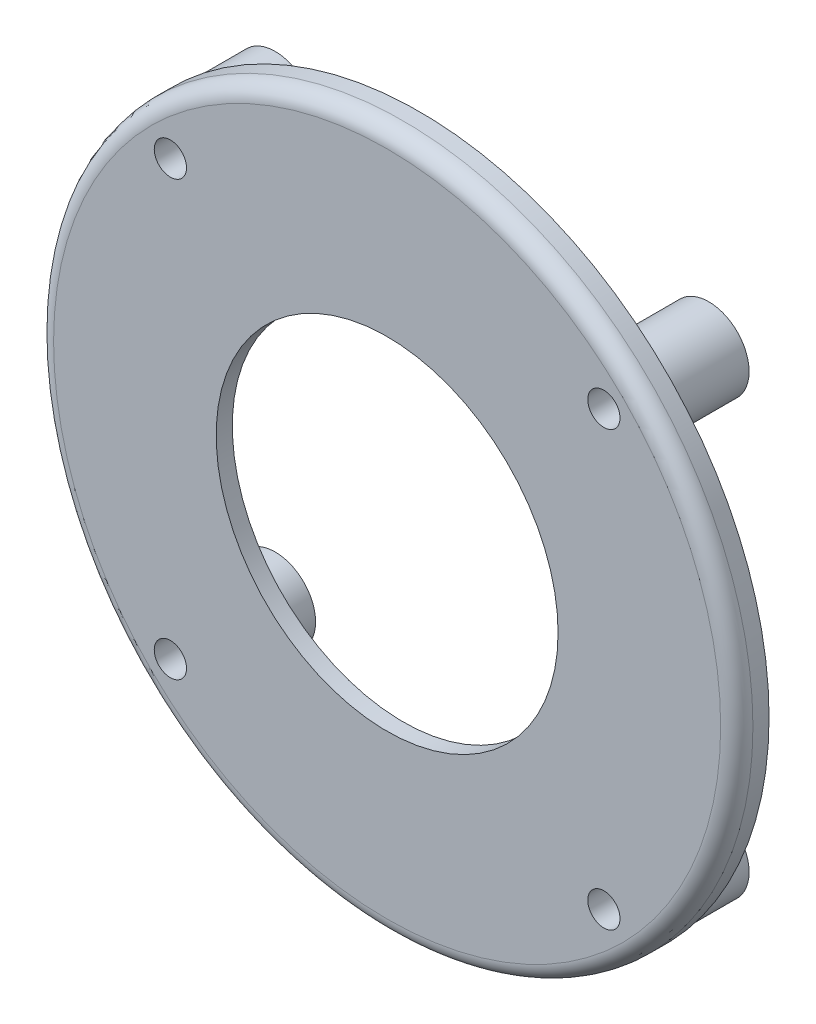
ISO-10303-21;
HEADER;
FILE_DESCRIPTION(('STEP AP214'),'2;1');
FILE_NAME('part.step','',(''),(''),'','','');
FILE_SCHEMA(('AUTOMOTIVE_DESIGN { 1 0 10303 214 1 1 1 1 }'));
ENDSEC;
DATA;
#1=APPLICATION_CONTEXT('core data for automotive mechanical design processes');
#2=APPLICATION_PROTOCOL_DEFINITION('international standard','automotive_design',2000,#1);
#3=PRODUCT_CONTEXT('',#1,'mechanical');
#4=PRODUCT('Part','Part','',(#3));
#5=PRODUCT_RELATED_PRODUCT_CATEGORY('part','',(#4));
#6=PRODUCT_DEFINITION_FORMATION('','',#4);
#7=PRODUCT_DEFINITION_CONTEXT('part definition',#1,'design');
#8=PRODUCT_DEFINITION('design','',#6,#7);
#9=PRODUCT_DEFINITION_SHAPE('','',#8);
#10=(LENGTH_UNIT() NAMED_UNIT(*) SI_UNIT(.MILLI.,.METRE.));
#11=(NAMED_UNIT(*) PLANE_ANGLE_UNIT() SI_UNIT($,.RADIAN.));
#12=(NAMED_UNIT(*) SI_UNIT($,.STERADIAN.) SOLID_ANGLE_UNIT());
#13=UNCERTAINTY_MEASURE_WITH_UNIT(LENGTH_MEASURE(1.E-05),#10,'distance_accuracy_value','');
#14=(GEOMETRIC_REPRESENTATION_CONTEXT(3) GLOBAL_UNCERTAINTY_ASSIGNED_CONTEXT((#13)) GLOBAL_UNIT_ASSIGNED_CONTEXT((#10,
#11,#12)) REPRESENTATION_CONTEXT('',''));
#15=CARTESIAN_POINT('',(0.,0.,0.));
#16=DIRECTION('',(0.,0.,1.));
#17=DIRECTION('',(1.,0.,0.));
#18=AXIS2_PLACEMENT_3D('',#15,#16,#17);
#19=CARTESIAN_POINT('',(26.8844640576044,-24.9086338768124,-10.));
#20=DIRECTION('',(0.,0.,1.));
#21=DIRECTION('',(1.,0.,0.));
#22=AXIS2_PLACEMENT_3D('',#19,#20,#21);
#23=CYLINDRICAL_SURFACE('',#22,2.);
#24=CARTESIAN_POINT('',(26.8844640576046,-24.9086338768121,3.));
#25=DIRECTION('',(0.,0.,1.));
#26=DIRECTION('',(0.,-1.,0.));
#27=AXIS2_PLACEMENT_3D('',#24,#25,#26);
#28=CIRCLE('',#27,2.);
#29=CARTESIAN_POINT('',(26.8844640576047,-26.9086338768121,3.));
#30=VERTEX_POINT('',#29);
#31=EDGE_CURVE('E128',#30,#30,#28,.T.);
#32=ORIENTED_EDGE('',*,*,#31,.T.);
#33=EDGE_LOOP('',(#32));
#34=FACE_BOUND('',#33,.T.);
#35=CARTESIAN_POINT('',(26.8844640576044,-24.9086338768124,-6.));
#36=DIRECTION('',(0.,0.,-1.));
#37=DIRECTION('',(-1.,0.,0.));
#38=AXIS2_PLACEMENT_3D('',#35,#36,#37);
#39=CIRCLE('',#38,2.);
#40=CARTESIAN_POINT('',(24.8844640576044,-24.9086338768124,-6.));
#41=VERTEX_POINT('',#40);
#42=EDGE_CURVE('E10',#41,#41,#39,.F.);
#43=ORIENTED_EDGE('',*,*,#42,.F.);
#44=EDGE_LOOP('',(#43));
#45=FACE_BOUND('',#44,.T.);
#46=ADVANCED_FACE('F39',(#34,#45),#23,.F.);
#47=CARTESIAN_POINT('',(-26.8556513125733,-24.9086338768125,-10.));
#48=DIRECTION('',(0.,0.,1.));
#49=DIRECTION('',(1.,0.,0.));
#50=AXIS2_PLACEMENT_3D('',#47,#48,#49);
#51=CYLINDRICAL_SURFACE('',#50,2.);
#52=CARTESIAN_POINT('',(-26.8556513125732,-24.9086338768125,3.));
#53=DIRECTION('',(0.,0.,1.));
#54=DIRECTION('',(-1.,0.,0.));
#55=AXIS2_PLACEMENT_3D('',#52,#53,#54);
#56=CIRCLE('',#55,2.);
#57=CARTESIAN_POINT('',(-28.8556513125732,-24.9086338768125,3.));
#58=VERTEX_POINT('',#57);
#59=EDGE_CURVE('E132',#58,#58,#56,.T.);
#60=ORIENTED_EDGE('',*,*,#59,.T.);
#61=EDGE_LOOP('',(#60));
#62=FACE_BOUND('',#61,.T.);
#63=CARTESIAN_POINT('',(-26.8556513125733,-24.9086338768125,-6.));
#64=DIRECTION('',(0.,0.,-1.));
#65=DIRECTION('',(-1.,0.,0.));
#66=AXIS2_PLACEMENT_3D('',#63,#64,#65);
#67=CIRCLE('',#66,2.);
#68=CARTESIAN_POINT('',(-28.8556513125732,-24.9086338768125,-6.));
#69=VERTEX_POINT('',#68);
#70=EDGE_CURVE('E47',#69,#69,#67,.F.);
#71=ORIENTED_EDGE('',*,*,#70,.F.);
#72=EDGE_LOOP('',(#71));
#73=FACE_BOUND('',#72,.T.);
#74=ADVANCED_FACE('F201',(#62,#73),#51,.F.);
#75=CARTESIAN_POINT('',(-26.8556513125733,28.8314814933651,-10.));
#76=DIRECTION('',(0.,0.,1.));
#77=DIRECTION('',(1.,0.,0.));
#78=AXIS2_PLACEMENT_3D('',#75,#76,#77);
#79=CYLINDRICAL_SURFACE('',#78,2.);
#80=CARTESIAN_POINT('',(-26.8556513125734,28.831481493365,3.));
#81=DIRECTION('',(0.,0.,1.));
#82=DIRECTION('',(0.,1.,0.));
#83=AXIS2_PLACEMENT_3D('',#80,#81,#82);
#84=CIRCLE('',#83,2.);
#85=CARTESIAN_POINT('',(-26.8556513125734,30.831481493365,3.));
#86=VERTEX_POINT('',#85);
#87=EDGE_CURVE('E127',#86,#86,#84,.T.);
#88=ORIENTED_EDGE('',*,*,#87,.T.);
#89=EDGE_LOOP('',(#88));
#90=FACE_BOUND('',#89,.T.);
#91=CARTESIAN_POINT('',(-26.8556513125733,28.8314814933651,-6.));
#92=DIRECTION('',(0.,0.,-1.));
#93=DIRECTION('',(-1.,0.,0.));
#94=AXIS2_PLACEMENT_3D('',#91,#92,#93);
#95=CIRCLE('',#94,2.);
#96=CARTESIAN_POINT('',(-28.8556513125733,28.8314814933651,-6.));
#97=VERTEX_POINT('',#96);
#98=EDGE_CURVE('E52',#97,#97,#95,.F.);
#99=ORIENTED_EDGE('',*,*,#98,.F.);
#100=EDGE_LOOP('',(#99));
#101=FACE_BOUND('',#100,.T.);
#102=ADVANCED_FACE('F207',(#90,#101),#79,.F.);
#103=CARTESIAN_POINT('',(26.8844640576043,28.8314814933652,-10.));
#104=DIRECTION('',(0.,0.,1.));
#105=DIRECTION('',(1.,0.,0.));
#106=AXIS2_PLACEMENT_3D('',#103,#104,#105);
#107=CYLINDRICAL_SURFACE('',#106,2.);
#108=CARTESIAN_POINT('',(26.8844640576043,28.8314814933652,3.));
#109=DIRECTION('',(0.,0.,1.));
#110=DIRECTION('',(1.,0.,0.));
#111=AXIS2_PLACEMENT_3D('',#108,#109,#110);
#112=CIRCLE('',#111,2.);
#113=CARTESIAN_POINT('',(28.8844640576043,28.8314814933652,3.));
#114=VERTEX_POINT('',#113);
#115=EDGE_CURVE('E120',#114,#114,#112,.T.);
#116=ORIENTED_EDGE('',*,*,#115,.T.);
#117=EDGE_LOOP('',(#116));
#118=FACE_BOUND('',#117,.T.);
#119=CARTESIAN_POINT('',(26.8844640576043,28.8314814933652,-6.));
#120=DIRECTION('',(0.,0.,-1.));
#121=DIRECTION('',(-1.,0.,0.));
#122=AXIS2_PLACEMENT_3D('',#119,#120,#121);
#123=CIRCLE('',#122,2.);
#124=CARTESIAN_POINT('',(24.8844640576042,28.8314814933652,-6.));
#125=VERTEX_POINT('',#124);
#126=EDGE_CURVE('E57',#125,#125,#123,.F.);
#127=ORIENTED_EDGE('',*,*,#126,.F.);
#128=EDGE_LOOP('',(#127));
#129=FACE_BOUND('',#128,.T.);
#130=ADVANCED_FACE('F195',(#118,#129),#107,.F.);
#131=CARTESIAN_POINT('',(26.8844640576044,-24.9086338768124,-10.));
#132=DIRECTION('',(0.,0.,1.));
#133=DIRECTION('',(1.,0.,0.));
#134=AXIS2_PLACEMENT_3D('',#131,#132,#133);
#135=CYLINDRICAL_SURFACE('',#134,5.);
#136=CARTESIAN_POINT('',(26.8844640576044,-24.9086338768124,-10.));
#137=DIRECTION('',(0.,0.,1.));
#138=DIRECTION('',(1.,0.,0.));
#139=AXIS2_PLACEMENT_3D('',#136,#137,#138);
#140=CIRCLE('',#139,5.);
#141=CARTESIAN_POINT('',(31.8844640576044,-24.9086338768124,-10.));
#142=VERTEX_POINT('',#141);
#143=EDGE_CURVE('E75',#142,#142,#140,.T.);
#144=ORIENTED_EDGE('',*,*,#143,.T.);
#145=EDGE_LOOP('',(#144));
#146=FACE_BOUND('',#145,.T.);
#147=CARTESIAN_POINT('',(26.8844640576044,-24.9086338768124,-1.));
#148=DIRECTION('',(0.,0.,1.));
#149=DIRECTION('',(1.,0.,0.));
#150=AXIS2_PLACEMENT_3D('',#147,#148,#149);
#151=CIRCLE('',#150,5.);
#152=CARTESIAN_POINT('',(31.8844640576044,-24.9086338768124,-1.));
#153=VERTEX_POINT('',#152);
#154=EDGE_CURVE('E95',#153,#153,#151,.F.);
#155=ORIENTED_EDGE('',*,*,#154,.T.);
#156=EDGE_LOOP('',(#155));
#157=FACE_BOUND('',#156,.T.);
#158=ADVANCED_FACE('F183',(#146,#157),#135,.T.);
#159=CARTESIAN_POINT('',(26.8844640576044,-24.9086338768124,-10.));
#160=DIRECTION('',(0.,0.,1.));
#161=DIRECTION('',(1.,0.,0.));
#162=AXIS2_PLACEMENT_3D('',#159,#160,#161);
#163=PLANE('',#162);
#164=ORIENTED_EDGE('',*,*,#143,.F.);
#165=EDGE_LOOP('',(#164));
#166=FACE_BOUND('',#165,.T.);
#167=CARTESIAN_POINT('',(26.8844640576046,-24.9086338768121,-10.));
#168=DIRECTION('',(0.,0.,-1.));
#169=DIRECTION('',(0.,1.,0.));
#170=AXIS2_PLACEMENT_3D('',#167,#168,#169);
#171=CIRCLE('',#170,1.55);
#172=CARTESIAN_POINT('',(26.8844640576046,-23.3586338768121,-10.));
#173=VERTEX_POINT('',#172);
#174=EDGE_CURVE('E164',#173,#173,#171,.T.);
#175=ORIENTED_EDGE('',*,*,#174,.F.);
#176=EDGE_LOOP('',(#175));
#177=FACE_BOUND('',#176,.T.);
#178=ADVANCED_FACE('F180',(#166,#177),#163,.F.);
#179=CARTESIAN_POINT('',(0.014406372515511,1.96142380827636,-1.));
#180=DIRECTION('',(0.,0.,1.));
#181=DIRECTION('',(1.,0.,0.));
#182=AXIS2_PLACEMENT_3D('',#179,#180,#181);
#183=PLANE('',#182);
#184=CARTESIAN_POINT('',(26.8844640576043,28.8314814933652,-1.));
#185=DIRECTION('',(0.,0.,1.));
#186=DIRECTION('',(1.,0.,0.));
#187=AXIS2_PLACEMENT_3D('',#184,#185,#186);
#188=CIRCLE('',#187,5.);
#189=CARTESIAN_POINT('',(31.8844640576042,28.8314814933652,-1.));
#190=VERTEX_POINT('',#189);
#191=EDGE_CURVE('E76',#190,#190,#188,.T.);
#192=ORIENTED_EDGE('',*,*,#191,.T.);
#193=EDGE_LOOP('',(#192));
#194=FACE_BOUND('',#193,.T.);
#195=CARTESIAN_POINT('',(-26.8556513125733,28.8314814933651,-1.));
#196=DIRECTION('',(0.,0.,1.));
#197=DIRECTION('',(1.,0.,0.));
#198=AXIS2_PLACEMENT_3D('',#195,#196,#197);
#199=CIRCLE('',#198,5.);
#200=CARTESIAN_POINT('',(-21.8556513125733,28.8314814933651,-1.));
#201=VERTEX_POINT('',#200);
#202=EDGE_CURVE('E82',#201,#201,#199,.T.);
#203=ORIENTED_EDGE('',*,*,#202,.T.);
#204=EDGE_LOOP('',(#203));
#205=FACE_BOUND('',#204,.T.);
#206=CARTESIAN_POINT('',(-26.8556513125733,-24.9086338768125,-1.));
#207=DIRECTION('',(0.,0.,1.));
#208=DIRECTION('',(1.,0.,0.));
#209=AXIS2_PLACEMENT_3D('',#206,#207,#208);
#210=CIRCLE('',#209,5.);
#211=CARTESIAN_POINT('',(-21.8556513125732,-24.9086338768125,-1.));
#212=VERTEX_POINT('',#211);
#213=EDGE_CURVE('E87',#212,#212,#210,.T.);
#214=ORIENTED_EDGE('',*,*,#213,.T.);
#215=EDGE_LOOP('',(#214));
#216=FACE_BOUND('',#215,.T.);
#217=ORIENTED_EDGE('',*,*,#154,.F.);
#218=EDGE_LOOP('',(#217));
#219=FACE_BOUND('',#218,.T.);
#220=CARTESIAN_POINT('',(0.014406372515511,1.96142380827636,-1.));
#221=DIRECTION('',(0.,0.,1.));
#222=DIRECTION('',(1.,0.,0.));
#223=AXIS2_PLACEMENT_3D('',#220,#221,#222);
#224=CIRCLE('',#223,43.3477968540507);
#225=CARTESIAN_POINT('',(43.3622032265663,1.96142380827636,-1.));
#226=VERTEX_POINT('',#225);
#227=EDGE_CURVE('E99',#226,#226,#224,.T.);
#228=ORIENTED_EDGE('',*,*,#227,.F.);
#229=EDGE_LOOP('',(#228));
#230=FACE_BOUND('',#229,.T.);
#231=CARTESIAN_POINT('',(0.014406372515511,1.96142380827636,-1.));
#232=DIRECTION('',(0.,0.,1.));
#233=DIRECTION('',(1.,0.,0.));
#234=AXIS2_PLACEMENT_3D('',#231,#232,#233);
#235=CIRCLE('',#234,28.);
#236=CARTESIAN_POINT('',(28.0144063725155,1.96142380827636,-1.));
#237=VERTEX_POINT('',#236);
#238=EDGE_CURVE('E91',#237,#237,#235,.T.);
#239=ORIENTED_EDGE('',*,*,#238,.T.);
#240=EDGE_LOOP('',(#239));
#241=FACE_BOUND('',#240,.T.);
#242=ADVANCED_FACE('F182',(#194,#205,#216,#219,#230,#241),#183,.F.);
#243=CARTESIAN_POINT('',(0.014406372515511,1.96142380827636,1.));
#244=DIRECTION('',(0.,0.,-1.));
#245=DIRECTION('',(-1.,0.,0.));
#246=AXIS2_PLACEMENT_3D('',#243,#244,#245);
#247=CYLINDRICAL_SURFACE('',#246,43.3477968540507);
#248=CARTESIAN_POINT('',(0.014406372515511,1.96142380827636,1.));
#249=DIRECTION('',(0.,0.,1.));
#250=DIRECTION('',(1.,0.,0.));
#251=AXIS2_PLACEMENT_3D('',#248,#249,#250);
#252=CIRCLE('',#251,43.3477968540507);
#253=CARTESIAN_POINT('',(43.3622032265663,1.96142380827636,1.));
#254=VERTEX_POINT('',#253);
#255=EDGE_CURVE('E63',#254,#254,#252,.F.);
#256=ORIENTED_EDGE('',*,*,#255,.T.);
#257=EDGE_LOOP('',(#256));
#258=FACE_BOUND('',#257,.T.);
#259=ORIENTED_EDGE('',*,*,#227,.T.);
#260=EDGE_LOOP('',(#259));
#261=FACE_BOUND('',#260,.T.);
#262=ADVANCED_FACE('F191',(#258,#261),#247,.T.);
#263=CARTESIAN_POINT('',(-26.8556513125733,-24.9086338768125,-10.));
#264=DIRECTION('',(0.,0.,1.));
#265=DIRECTION('',(1.,0.,0.));
#266=AXIS2_PLACEMENT_3D('',#263,#264,#265);
#267=CYLINDRICAL_SURFACE('',#266,5.);
#268=CARTESIAN_POINT('',(-26.8556513125733,-24.9086338768125,-10.));
#269=DIRECTION('',(0.,0.,1.));
#270=DIRECTION('',(1.,0.,0.));
#271=AXIS2_PLACEMENT_3D('',#268,#269,#270);
#272=CIRCLE('',#271,5.);
#273=CARTESIAN_POINT('',(-21.8556513125732,-24.9086338768125,-10.));
#274=VERTEX_POINT('',#273);
#275=EDGE_CURVE('E86',#274,#274,#272,.T.);
#276=ORIENTED_EDGE('',*,*,#275,.T.);
#277=EDGE_LOOP('',(#276));
#278=FACE_BOUND('',#277,.T.);
#279=ORIENTED_EDGE('',*,*,#213,.F.);
#280=EDGE_LOOP('',(#279));
#281=FACE_BOUND('',#280,.T.);
#282=ADVANCED_FACE('F213',(#278,#281),#267,.T.);
#283=CARTESIAN_POINT('',(-26.8556513125733,-24.9086338768125,-10.));
#284=DIRECTION('',(0.,0.,1.));
#285=DIRECTION('',(1.,0.,0.));
#286=AXIS2_PLACEMENT_3D('',#283,#284,#285);
#287=PLANE('',#286);
#288=ORIENTED_EDGE('',*,*,#275,.F.);
#289=EDGE_LOOP('',(#288));
#290=FACE_BOUND('',#289,.T.);
#291=CARTESIAN_POINT('',(-26.8556513125732,-24.9086338768125,-10.));
#292=DIRECTION('',(0.,0.,-1.));
#293=DIRECTION('',(1.,0.,0.));
#294=AXIS2_PLACEMENT_3D('',#291,#292,#293);
#295=CIRCLE('',#294,1.55);
#296=CARTESIAN_POINT('',(-25.3056513125732,-24.9086338768125,-10.));
#297=VERTEX_POINT('',#296);
#298=EDGE_CURVE('E156',#297,#297,#295,.T.);
#299=ORIENTED_EDGE('',*,*,#298,.F.);
#300=EDGE_LOOP('',(#299));
#301=FACE_BOUND('',#300,.T.);
#302=ADVANCED_FACE('F218',(#290,#301),#287,.F.);
#303=CARTESIAN_POINT('',(-26.8556513125733,28.8314814933651,-10.));
#304=DIRECTION('',(0.,0.,1.));
#305=DIRECTION('',(1.,0.,0.));
#306=AXIS2_PLACEMENT_3D('',#303,#304,#305);
#307=CYLINDRICAL_SURFACE('',#306,5.);
#308=CARTESIAN_POINT('',(-26.8556513125733,28.8314814933651,-10.));
#309=DIRECTION('',(0.,0.,1.));
#310=DIRECTION('',(1.,0.,0.));
#311=AXIS2_PLACEMENT_3D('',#308,#309,#310);
#312=CIRCLE('',#311,5.);
#313=CARTESIAN_POINT('',(-21.8556513125733,28.8314814933651,-10.));
#314=VERTEX_POINT('',#313);
#315=EDGE_CURVE('E80',#314,#314,#312,.T.);
#316=ORIENTED_EDGE('',*,*,#315,.T.);
#317=EDGE_LOOP('',(#316));
#318=FACE_BOUND('',#317,.T.);
#319=ORIENTED_EDGE('',*,*,#202,.F.);
#320=EDGE_LOOP('',(#319));
#321=FACE_BOUND('',#320,.T.);
#322=ADVANCED_FACE('F220',(#318,#321),#307,.T.);
#323=CARTESIAN_POINT('',(-26.8556513125733,28.8314814933651,-10.));
#324=DIRECTION('',(0.,0.,1.));
#325=DIRECTION('',(1.,0.,0.));
#326=AXIS2_PLACEMENT_3D('',#323,#324,#325);
#327=PLANE('',#326);
#328=ORIENTED_EDGE('',*,*,#315,.F.);
#329=EDGE_LOOP('',(#328));
#330=FACE_BOUND('',#329,.T.);
#331=CARTESIAN_POINT('',(-26.8556513125734,28.831481493365,-10.));
#332=DIRECTION('',(0.,0.,-1.));
#333=DIRECTION('',(0.,-1.,0.));
#334=AXIS2_PLACEMENT_3D('',#331,#332,#333);
#335=CIRCLE('',#334,1.55);
#336=CARTESIAN_POINT('',(-26.8556513125734,27.281481493365,-10.));
#337=VERTEX_POINT('',#336);
#338=EDGE_CURVE('E148',#337,#337,#335,.T.);
#339=ORIENTED_EDGE('',*,*,#338,.F.);
#340=EDGE_LOOP('',(#339));
#341=FACE_BOUND('',#340,.T.);
#342=ADVANCED_FACE('F225',(#330,#341),#327,.F.);
#343=CARTESIAN_POINT('',(26.8844640576043,28.8314814933652,-10.));
#344=DIRECTION('',(0.,0.,1.));
#345=DIRECTION('',(1.,0.,0.));
#346=AXIS2_PLACEMENT_3D('',#343,#344,#345);
#347=CYLINDRICAL_SURFACE('',#346,5.);
#348=CARTESIAN_POINT('',(26.8844640576043,28.8314814933652,-10.));
#349=DIRECTION('',(0.,0.,1.));
#350=DIRECTION('',(1.,0.,0.));
#351=AXIS2_PLACEMENT_3D('',#348,#349,#350);
#352=CIRCLE('',#351,5.);
#353=CARTESIAN_POINT('',(31.8844640576042,28.8314814933652,-10.));
#354=VERTEX_POINT('',#353);
#355=EDGE_CURVE('E81',#354,#354,#352,.T.);
#356=ORIENTED_EDGE('',*,*,#355,.T.);
#357=EDGE_LOOP('',(#356));
#358=FACE_BOUND('',#357,.T.);
#359=ORIENTED_EDGE('',*,*,#191,.F.);
#360=EDGE_LOOP('',(#359));
#361=FACE_BOUND('',#360,.T.);
#362=ADVANCED_FACE('F229',(#358,#361),#347,.T.);
#363=CARTESIAN_POINT('',(26.8844640576043,28.8314814933652,-10.));
#364=DIRECTION('',(0.,0.,1.));
#365=DIRECTION('',(1.,0.,0.));
#366=AXIS2_PLACEMENT_3D('',#363,#364,#365);
#367=PLANE('',#366);
#368=ORIENTED_EDGE('',*,*,#355,.F.);
#369=EDGE_LOOP('',(#368));
#370=FACE_BOUND('',#369,.T.);
#371=CARTESIAN_POINT('',(26.8844640576043,28.8314814933652,-10.));
#372=DIRECTION('',(0.,0.,-1.));
#373=DIRECTION('',(-1.,0.,0.));
#374=AXIS2_PLACEMENT_3D('',#371,#372,#373);
#375=CIRCLE('',#374,1.55);
#376=CARTESIAN_POINT('',(25.3344640576043,28.8314814933652,-10.));
#377=VERTEX_POINT('',#376);
#378=EDGE_CURVE('E140',#377,#377,#375,.T.);
#379=ORIENTED_EDGE('',*,*,#378,.F.);
#380=EDGE_LOOP('',(#379));
#381=FACE_BOUND('',#380,.T.);
#382=ADVANCED_FACE('F236',(#370,#381),#367,.F.);
#383=CARTESIAN_POINT('',(0.014406372515511,1.96142380827636,3.));
#384=DIRECTION('',(0.,0.,1.));
#385=DIRECTION('',(1.,0.,0.));
#386=AXIS2_PLACEMENT_3D('',#383,#384,#385);
#387=PLANE('',#386);
#388=ORIENTED_EDGE('',*,*,#87,.F.);
#389=EDGE_LOOP('',(#388));
#390=FACE_BOUND('',#389,.T.);
#391=ORIENTED_EDGE('',*,*,#59,.F.);
#392=EDGE_LOOP('',(#391));
#393=FACE_BOUND('',#392,.T.);
#394=ORIENTED_EDGE('',*,*,#31,.F.);
#395=EDGE_LOOP('',(#394));
#396=FACE_BOUND('',#395,.T.);
#397=ORIENTED_EDGE('',*,*,#115,.F.);
#398=EDGE_LOOP('',(#397));
#399=FACE_BOUND('',#398,.T.);
#400=CARTESIAN_POINT('',(0.014406372515511,1.96142380827636,3.));
#401=DIRECTION('',(0.,0.,1.));
#402=DIRECTION('',(1.,0.,0.));
#403=AXIS2_PLACEMENT_3D('',#400,#401,#402);
#404=CIRCLE('',#403,41.3477968540508);
#405=CARTESIAN_POINT('',(41.3622032265663,1.96142380827636,3.));
#406=VERTEX_POINT('',#405);
#407=EDGE_CURVE('E67',#406,#406,#404,.T.);
#408=ORIENTED_EDGE('',*,*,#407,.T.);
#409=EDGE_LOOP('',(#408));
#410=FACE_BOUND('',#409,.T.);
#411=CARTESIAN_POINT('',(0.014406372515511,1.96142380827636,3.));
#412=DIRECTION('',(0.,0.,1.));
#413=DIRECTION('',(1.,0.,0.));
#414=AXIS2_PLACEMENT_3D('',#411,#412,#413);
#415=CIRCLE('',#414,21.1926730246976);
#416=CARTESIAN_POINT('',(21.2070793972131,1.96142380827636,3.));
#417=VERTEX_POINT('',#416);
#418=EDGE_CURVE('E115',#417,#417,#415,.T.);
#419=ORIENTED_EDGE('',*,*,#418,.F.);
#420=EDGE_LOOP('',(#419));
#421=FACE_BOUND('',#420,.T.);
#422=ADVANCED_FACE('F240',(#390,#393,#396,#399,#410,#421),#387,.T.);
#423=CARTESIAN_POINT('',(0.014406372515511,1.96142380827636,1.));
#424=DIRECTION('',(0.,0.,1.));
#425=DIRECTION('',(1.,0.,0.));
#426=AXIS2_PLACEMENT_3D('',#423,#424,#425);
#427=PLANE('',#426);
#428=CARTESIAN_POINT('',(0.014406372515511,1.96142380827636,1.));
#429=DIRECTION('',(0.,0.,1.));
#430=DIRECTION('',(1.,0.,0.));
#431=AXIS2_PLACEMENT_3D('',#428,#429,#430);
#432=CIRCLE('',#431,22.);
#433=CARTESIAN_POINT('',(22.0144063725155,1.96142380827636,1.));
#434=VERTEX_POINT('',#433);
#435=EDGE_CURVE('E71',#434,#434,#432,.F.);
#436=ORIENTED_EDGE('',*,*,#435,.T.);
#437=EDGE_LOOP('',(#436));
#438=FACE_BOUND('',#437,.T.);
#439=CARTESIAN_POINT('',(0.014406372515511,1.96142380827636,1.));
#440=DIRECTION('',(0.,0.,1.));
#441=DIRECTION('',(1.,0.,0.));
#442=AXIS2_PLACEMENT_3D('',#439,#440,#441);
#443=CIRCLE('',#442,21.1926730246976);
#444=CARTESIAN_POINT('',(21.2070793972131,1.96142380827636,1.));
#445=VERTEX_POINT('',#444);
#446=EDGE_CURVE('E116',#445,#445,#443,.T.);
#447=ORIENTED_EDGE('',*,*,#446,.T.);
#448=EDGE_LOOP('',(#447));
#449=FACE_BOUND('',#448,.T.);
#450=ADVANCED_FACE('F244',(#438,#449),#427,.F.);
#451=CARTESIAN_POINT('',(0.014406372515511,1.96142380827636,3.));
#452=DIRECTION('',(0.,0.,-1.));
#453=DIRECTION('',(-1.,0.,0.));
#454=AXIS2_PLACEMENT_3D('',#451,#452,#453);
#455=CYLINDRICAL_SURFACE('',#454,21.1926730246976);
#456=ORIENTED_EDGE('',*,*,#418,.T.);
#457=EDGE_LOOP('',(#456));
#458=FACE_BOUND('',#457,.T.);
#459=ORIENTED_EDGE('',*,*,#446,.F.);
#460=EDGE_LOOP('',(#459));
#461=FACE_BOUND('',#460,.T.);
#462=ADVANCED_FACE('F247',(#458,#461),#455,.F.);
#463=CARTESIAN_POINT('',(0.014406372515511,1.96142380827636,-9.));
#464=DIRECTION('',(0.,0.,-1.));
#465=DIRECTION('',(-1.,0.,0.));
#466=AXIS2_PLACEMENT_3D('',#463,#464,#465);
#467=TOROIDAL_SURFACE('',#466,22.,10.);
#468=ORIENTED_EDGE('',*,*,#435,.F.);
#469=EDGE_LOOP('',(#468));
#470=FACE_BOUND('',#469,.T.);
#471=ORIENTED_EDGE('',*,*,#238,.F.);
#472=EDGE_LOOP('',(#471));
#473=FACE_BOUND('',#472,.T.);
#474=ADVANCED_FACE('F254',(#470,#473),#467,.F.);
#475=CARTESIAN_POINT('',(0.014406372515511,1.96142380827636,1.));
#476=DIRECTION('',(0.,0.,1.));
#477=DIRECTION('',(1.,0.,0.));
#478=AXIS2_PLACEMENT_3D('',#475,#476,#477);
#479=TOROIDAL_SURFACE('',#478,41.3477968540508,2.);
#480=ORIENTED_EDGE('',*,*,#255,.F.);
#481=EDGE_LOOP('',(#480));
#482=FACE_BOUND('',#481,.T.);
#483=ORIENTED_EDGE('',*,*,#407,.F.);
#484=EDGE_LOOP('',(#483));
#485=FACE_BOUND('',#484,.T.);
#486=ADVANCED_FACE('F41',(#482,#485),#479,.T.);
#487=CARTESIAN_POINT('',(26.8844640576043,28.8314814933652,-6.));
#488=DIRECTION('',(0.,0.,-1.));
#489=DIRECTION('',(-1.,0.,0.));
#490=AXIS2_PLACEMENT_3D('',#487,#488,#489);
#491=PLANE('',#490);
#492=CARTESIAN_POINT('',(26.8844640576043,28.8314814933652,-6.));
#493=DIRECTION('',(0.,0.,-1.));
#494=DIRECTION('',(-1.,0.,0.));
#495=AXIS2_PLACEMENT_3D('',#492,#493,#494);
#496=CIRCLE('',#495,1.55);
#497=CARTESIAN_POINT('',(25.3344640576043,28.8314814933652,-6.));
#498=VERTEX_POINT('',#497);
#499=EDGE_CURVE('E133',#498,#498,#496,.T.);
#500=ORIENTED_EDGE('',*,*,#499,.T.);
#501=EDGE_LOOP('',(#500));
#502=FACE_BOUND('',#501,.T.);
#503=ORIENTED_EDGE('',*,*,#126,.T.);
#504=EDGE_LOOP('',(#503));
#505=FACE_BOUND('',#504,.T.);
#506=ADVANCED_FACE('F256',(#502,#505),#491,.F.);
#507=CARTESIAN_POINT('',(26.8844640576043,28.8314814933652,-6.));
#508=DIRECTION('',(0.,0.,-1.));
#509=DIRECTION('',(-1.,0.,0.));
#510=AXIS2_PLACEMENT_3D('',#507,#508,#509);
#511=CYLINDRICAL_SURFACE('',#510,1.55);
#512=ORIENTED_EDGE('',*,*,#499,.F.);
#513=EDGE_LOOP('',(#512));
#514=FACE_BOUND('',#513,.T.);
#515=ORIENTED_EDGE('',*,*,#378,.T.);
#516=EDGE_LOOP('',(#515));
#517=FACE_BOUND('',#516,.T.);
#518=ADVANCED_FACE('F259',(#514,#517),#511,.F.);
#519=CARTESIAN_POINT('',(-26.8556513125734,28.831481493365,-6.));
#520=DIRECTION('',(0.,0.,-1.));
#521=DIRECTION('',(0.,-1.,0.));
#522=AXIS2_PLACEMENT_3D('',#519,#520,#521);
#523=PLANE('',#522);
#524=CARTESIAN_POINT('',(-26.8556513125734,28.831481493365,-6.));
#525=DIRECTION('',(0.,0.,-1.));
#526=DIRECTION('',(0.,-1.,0.));
#527=AXIS2_PLACEMENT_3D('',#524,#525,#526);
#528=CIRCLE('',#527,1.55);
#529=CARTESIAN_POINT('',(-26.8556513125734,27.281481493365,-6.));
#530=VERTEX_POINT('',#529);
#531=EDGE_CURVE('E144',#530,#530,#528,.T.);
#532=ORIENTED_EDGE('',*,*,#531,.T.);
#533=EDGE_LOOP('',(#532));
#534=FACE_BOUND('',#533,.T.);
#535=ORIENTED_EDGE('',*,*,#98,.T.);
#536=EDGE_LOOP('',(#535));
#537=FACE_BOUND('',#536,.T.);
#538=ADVANCED_FACE('F263',(#534,#537),#523,.F.);
#539=CARTESIAN_POINT('',(-26.8556513125734,28.831481493365,-6.));
#540=DIRECTION('',(0.,0.,-1.));
#541=DIRECTION('',(-1.,0.,0.));
#542=AXIS2_PLACEMENT_3D('',#539,#540,#541);
#543=CYLINDRICAL_SURFACE('',#542,1.55);
#544=ORIENTED_EDGE('',*,*,#531,.F.);
#545=EDGE_LOOP('',(#544));
#546=FACE_BOUND('',#545,.T.);
#547=ORIENTED_EDGE('',*,*,#338,.T.);
#548=EDGE_LOOP('',(#547));
#549=FACE_BOUND('',#548,.T.);
#550=ADVANCED_FACE('F267',(#546,#549),#543,.F.);
#551=CARTESIAN_POINT('',(-26.8556513125732,-24.9086338768125,-6.));
#552=DIRECTION('',(0.,0.,-1.));
#553=DIRECTION('',(1.,0.,0.));
#554=AXIS2_PLACEMENT_3D('',#551,#552,#553);
#555=PLANE('',#554);
#556=CARTESIAN_POINT('',(-26.8556513125732,-24.9086338768125,-6.));
#557=DIRECTION('',(0.,0.,-1.));
#558=DIRECTION('',(1.,0.,0.));
#559=AXIS2_PLACEMENT_3D('',#556,#557,#558);
#560=CIRCLE('',#559,1.55);
#561=CARTESIAN_POINT('',(-25.3056513125732,-24.9086338768125,-6.));
#562=VERTEX_POINT('',#561);
#563=EDGE_CURVE('E152',#562,#562,#560,.T.);
#564=ORIENTED_EDGE('',*,*,#563,.T.);
#565=EDGE_LOOP('',(#564));
#566=FACE_BOUND('',#565,.T.);
#567=ORIENTED_EDGE('',*,*,#70,.T.);
#568=EDGE_LOOP('',(#567));
#569=FACE_BOUND('',#568,.T.);
#570=ADVANCED_FACE('F271',(#566,#569),#555,.F.);
#571=CARTESIAN_POINT('',(-26.8556513125732,-24.9086338768125,-6.));
#572=DIRECTION('',(0.,0.,-1.));
#573=DIRECTION('',(-1.,0.,0.));
#574=AXIS2_PLACEMENT_3D('',#571,#572,#573);
#575=CYLINDRICAL_SURFACE('',#574,1.55);
#576=ORIENTED_EDGE('',*,*,#563,.F.);
#577=EDGE_LOOP('',(#576));
#578=FACE_BOUND('',#577,.T.);
#579=ORIENTED_EDGE('',*,*,#298,.T.);
#580=EDGE_LOOP('',(#579));
#581=FACE_BOUND('',#580,.T.);
#582=ADVANCED_FACE('F275',(#578,#581),#575,.F.);
#583=CARTESIAN_POINT('',(26.8844640576046,-24.9086338768121,-6.));
#584=DIRECTION('',(0.,0.,-1.));
#585=DIRECTION('',(0.,1.,0.));
#586=AXIS2_PLACEMENT_3D('',#583,#584,#585);
#587=PLANE('',#586);
#588=CARTESIAN_POINT('',(26.8844640576046,-24.9086338768121,-6.));
#589=DIRECTION('',(0.,0.,-1.));
#590=DIRECTION('',(0.,1.,0.));
#591=AXIS2_PLACEMENT_3D('',#588,#589,#590);
#592=CIRCLE('',#591,1.55);
#593=CARTESIAN_POINT('',(26.8844640576046,-23.3586338768121,-6.));
#594=VERTEX_POINT('',#593);
#595=EDGE_CURVE('E160',#594,#594,#592,.T.);
#596=ORIENTED_EDGE('',*,*,#595,.T.);
#597=EDGE_LOOP('',(#596));
#598=FACE_BOUND('',#597,.T.);
#599=ORIENTED_EDGE('',*,*,#42,.T.);
#600=EDGE_LOOP('',(#599));
#601=FACE_BOUND('',#600,.T.);
#602=ADVANCED_FACE('F172',(#598,#601),#587,.F.);
#603=CARTESIAN_POINT('',(26.8844640576046,-24.9086338768121,-6.));
#604=DIRECTION('',(0.,0.,-1.));
#605=DIRECTION('',(-1.,0.,0.));
#606=AXIS2_PLACEMENT_3D('',#603,#604,#605);
#607=CYLINDRICAL_SURFACE('',#606,1.55);
#608=ORIENTED_EDGE('',*,*,#595,.F.);
#609=EDGE_LOOP('',(#608));
#610=FACE_BOUND('',#609,.T.);
#611=ORIENTED_EDGE('',*,*,#174,.T.);
#612=EDGE_LOOP('',(#611));
#613=FACE_BOUND('',#612,.T.);
#614=ADVANCED_FACE('F174',(#610,#613),#607,.F.);
#615=CLOSED_SHELL('',(#46,#74,#102,#130,#158,#178,#242,#262,#282,#302,#322,#342,#362,#382,#422,
#450,#462,#474,#486,#506,#518,#538,#550,#570,#582,#602,#614));
#616=MANIFOLD_SOLID_BREP('B2',#615);
#617=ADVANCED_BREP_SHAPE_REPRESENTATION('',(#18,#616),#14);
#618=SHAPE_DEFINITION_REPRESENTATION(#9,#617);
ENDSEC;
END-ISO-10303-21;
